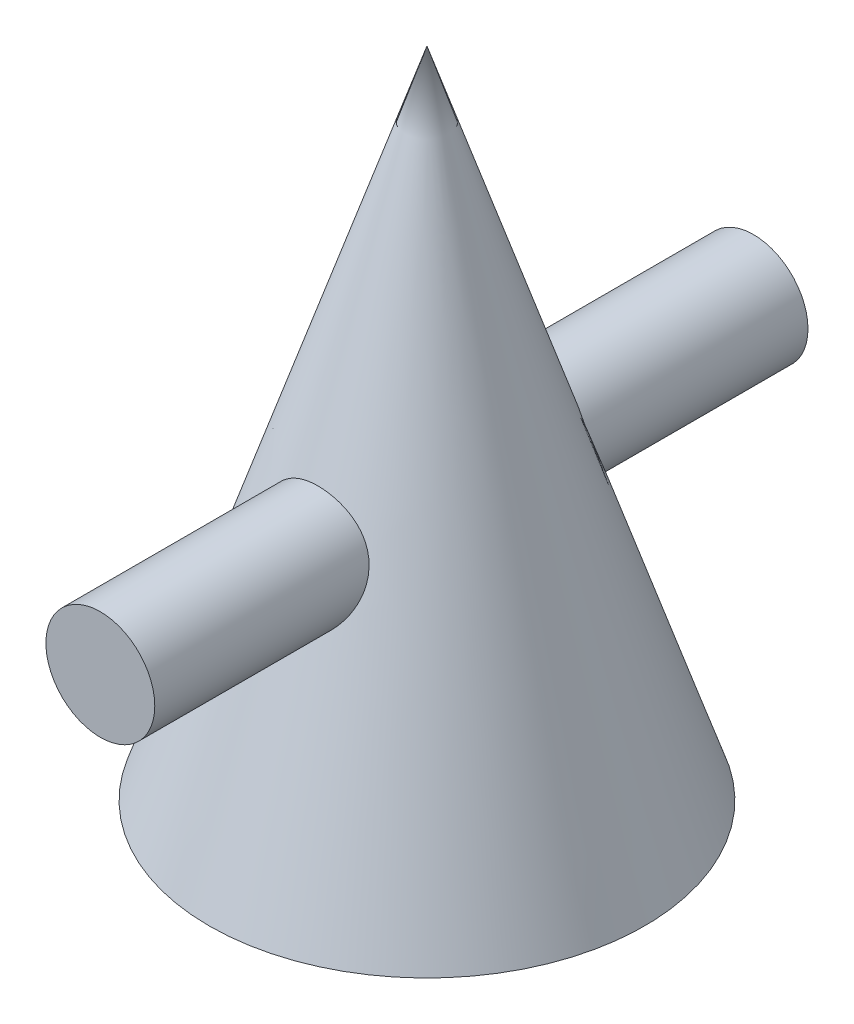
ISO-10303-21;
HEADER;
FILE_DESCRIPTION(('STEP AP214'),'2;1');
FILE_NAME('part.step','',(''),(''),'','','');
FILE_SCHEMA(('AUTOMOTIVE_DESIGN { 1 0 10303 214 1 1 1 1 }'));
ENDSEC;
DATA;
#1=APPLICATION_CONTEXT('core data for automotive mechanical design processes');
#2=APPLICATION_PROTOCOL_DEFINITION('international standard','automotive_design',2000,#1);
#3=PRODUCT_CONTEXT('',#1,'mechanical');
#4=PRODUCT('Part','Part','',(#3));
#5=PRODUCT_RELATED_PRODUCT_CATEGORY('part','',(#4));
#6=PRODUCT_DEFINITION_FORMATION('','',#4);
#7=PRODUCT_DEFINITION_CONTEXT('part definition',#1,'design');
#8=PRODUCT_DEFINITION('design','',#6,#7);
#9=PRODUCT_DEFINITION_SHAPE('','',#8);
#10=(LENGTH_UNIT() NAMED_UNIT(*) SI_UNIT(.MILLI.,.METRE.));
#11=(NAMED_UNIT(*) PLANE_ANGLE_UNIT() SI_UNIT($,.RADIAN.));
#12=(NAMED_UNIT(*) SI_UNIT($,.STERADIAN.) SOLID_ANGLE_UNIT());
#13=UNCERTAINTY_MEASURE_WITH_UNIT(LENGTH_MEASURE(1.E-05),#10,'distance_accuracy_value','');
#14=(GEOMETRIC_REPRESENTATION_CONTEXT(3) GLOBAL_UNCERTAINTY_ASSIGNED_CONTEXT((#13)) GLOBAL_UNIT_ASSIGNED_CONTEXT((#10,
#11,#12)) REPRESENTATION_CONTEXT('',''));
#15=CARTESIAN_POINT('',(0.,0.,0.));
#16=DIRECTION('',(0.,0.,1.));
#17=DIRECTION('',(1.,0.,0.));
#18=AXIS2_PLACEMENT_3D('',#15,#16,#17);
#19=CARTESIAN_POINT('',(0.,0.,0.));
#20=DIRECTION('',(0.,1.,0.));
#21=DIRECTION('',(0.,0.,1.));
#22=AXIS2_PLACEMENT_3D('',#19,#20,#21);
#23=PLANE('',#22);
#24=CARTESIAN_POINT('',(0.,0.,0.));
#25=DIRECTION('',(0.,1.,0.));
#26=DIRECTION('',(0.,0.,1.));
#27=AXIS2_PLACEMENT_3D('',#24,#25,#26);
#28=CIRCLE('',#27,20.);
#29=CARTESIAN_POINT('',(0.,0.,20.));
#30=VERTEX_POINT('',#29);
#31=EDGE_CURVE('E76',#30,#30,#28,.T.);
#32=ORIENTED_EDGE('',*,*,#31,.F.);
#33=EDGE_LOOP('',(#32));
#34=FACE_BOUND('',#33,.T.);
#35=ADVANCED_FACE('F42',(#34),#23,.F.);
#36=CARTESIAN_POINT('',(0.,60.,0.));
#37=DIRECTION('',(0.,-1.,0.));
#38=DIRECTION('',(0.,0.,-1.));
#39=AXIS2_PLACEMENT_3D('',#36,#37,#38);
#40=CONICAL_SURFACE('',#39,0.,0.321750554396642);
#41=CARTESIAN_POINT('',(-3.2209332369045,21.1756571595625,-12.5342183900275));
#42=CARTESIAN_POINT('',(-3.45925500497229,21.3763857942544,-12.4038884364813));
#43=CARTESIAN_POINT('',(-3.67614715504448,21.5971953916883,-12.2638412858528));
#44=CARTESIAN_POINT('',(-3.96673131480652,21.9522717403562,-12.0468249400583));
#45=CARTESIAN_POINT('',(-4.05795852596773,22.0748965122797,-11.9731629484742));
#46=CARTESIAN_POINT('',(-4.22855047512522,22.3274460681251,-11.8246187516191));
#47=CARTESIAN_POINT('',(-4.30791729823006,22.4573695633602,-11.7497367634021));
#48=CARTESIAN_POINT('',(-4.52739417497622,22.8564616705921,-11.5252847148287));
#49=CARTESIAN_POINT('',(-4.64947469715935,23.1356818490527,-11.3754539497436));
#50=CARTESIAN_POINT('',(-4.84172710109212,23.7151772323372,-11.0845119427179));
#51=CARTESIAN_POINT('',(-4.9119760224788,24.0154204593751,-10.9433880466567));
#52=CARTESIAN_POINT('',(-4.98954299859606,24.5837508838531,-10.6994685693297));
#53=CARTESIAN_POINT('',(-5.00493816468511,24.849593267777,-10.5941240012219));
#54=CARTESIAN_POINT('',(-4.99543916036162,25.2523248410625,-10.4499517010728));
#55=CARTESIAN_POINT('',(-4.98683558300799,25.3872590700205,-10.404193457849));
#56=CARTESIAN_POINT('',(-4.95842927158534,25.6575887624345,-10.3178784384733));
#57=CARTESIAN_POINT('',(-4.93863142830989,25.792983998815,-10.2773194002667));
#58=CARTESIAN_POINT('',(-4.88742584967866,26.0640564284338,-10.2016679998235));
#59=CARTESIAN_POINT('',(-4.85594613370615,26.1997300711346,-10.1666114896814));
#60=CARTESIAN_POINT('',(-4.78130450758494,26.4692397836161,-10.1026268922091));
#61=CARTESIAN_POINT('',(-4.73814785944398,26.6030766526323,-10.0736960548926));
#62=CARTESIAN_POINT('',(-4.6402261945146,26.8676725610154,-10.0220638934974));
#63=CARTESIAN_POINT('',(-4.58546122747281,26.9984316135693,-9.99936254272369));
#64=CARTESIAN_POINT('',(-4.46460194291903,27.2555496525593,-9.96005792576671));
#65=CARTESIAN_POINT('',(-4.3985084488912,27.3819089580156,-9.94345421661411));
#66=CARTESIAN_POINT('',(-4.2624684814096,27.6168581634779,-9.91730528108162));
#67=CARTESIAN_POINT('',(-4.19353293133286,27.7259765052706,-9.90722810942536));
#68=CARTESIAN_POINT('',(-4.04724490537266,27.9387900961235,-9.89128048284768));
#69=CARTESIAN_POINT('',(-3.96988973783807,28.0424835951474,-9.88541137777138));
#70=CARTESIAN_POINT('',(-3.80731127142618,28.2436236632803,-9.87733817465923));
#71=CARTESIAN_POINT('',(-3.72208966282289,28.3410715668004,-9.87513329121261));
#72=CARTESIAN_POINT('',(-3.54432963755793,28.5290922280842,-9.87375858867057));
#73=CARTESIAN_POINT('',(-3.45178855070068,28.6196624529864,-9.87458988223604));
#74=CARTESIAN_POINT('',(-3.16001228576675,28.8838127230544,-9.88072795687417));
#75=CARTESIAN_POINT('',(-2.95000331391139,29.0456448041604,-9.88979317421766));
#76=CARTESIAN_POINT('',(-2.50721121311983,29.334021634437,-9.91210009707711));
#77=CARTESIAN_POINT('',(-2.27442319991413,29.4605587931953,-9.92534269966527));
#78=CARTESIAN_POINT('',(-1.90561365072037,29.6247391077765,-9.94495457093931));
#79=CARTESIAN_POINT('',(-1.77559817452167,29.676194750393,-9.95162611774901));
#80=CARTESIAN_POINT('',(-1.51169594903751,29.7680467416729,-9.96414977537509));
#81=CARTESIAN_POINT('',(-1.37781051741817,29.8084468066887,-9.97000216122992));
#82=CARTESIAN_POINT('',(-1.10706366299679,29.8779044315475,-9.98039418618203));
#83=CARTESIAN_POINT('',(-0.970201785626572,29.9069602458502,-9.984933623228));
#84=CARTESIAN_POINT('',(-0.694479317916108,29.9535081417865,-9.99233900223082));
#85=CARTESIAN_POINT('',(-0.555618754026798,29.9710003763108,-9.99520496631384));
#86=CARTESIAN_POINT('',(-0.276744576835285,29.9942979789291,-9.99904404947883));
#87=CARTESIAN_POINT('',(-0.136729888518575,30.0000908188561,-10.0000151394182));
#88=CARTESIAN_POINT('',(0.143292288606563,29.9999070278888,-9.99998450170604));
#89=CARTESIAN_POINT('',(0.283299777379557,29.9939303437495,-9.99898276512944));
#90=CARTESIAN_POINT('',(0.562292931787183,29.9702541673028,-9.99508273819074));
#91=CARTESIAN_POINT('',(0.701278594226469,29.9525546383526,-9.99218444190046));
#92=CARTESIAN_POINT('',(0.97723046606362,29.9055692873507,-9.98471533911539));
#93=CARTESIAN_POINT('',(1.11419667987909,29.8762834906481,-9.98014453627982));
#94=CARTESIAN_POINT('',(1.38407692971106,29.8066205246694,-9.96973638392942));
#95=CARTESIAN_POINT('',(1.51701435684635,29.7663323593887,-9.96390927377048));
#96=CARTESIAN_POINT('',(1.77909192365652,29.6748372392566,-9.95144797774949));
#97=CARTESIAN_POINT('',(1.90823065417155,29.6236262892057,-9.94481349695988));
#98=CARTESIAN_POINT('',(2.16177754910499,29.5106516366006,-9.93133475118512));
#99=CARTESIAN_POINT('',(2.28618623807247,29.448889108386,-9.92449050961483));
#100=CARTESIAN_POINT('',(2.52949850178004,29.3151955836293,-9.9112795032193));
#101=CARTESIAN_POINT('',(2.6484001298698,29.2432610273238,-9.9049129067478));
#102=CARTESIAN_POINT('',(2.88142745766641,29.088666145443,-9.89334821150828));
#103=CARTESIAN_POINT('',(2.99546593103022,29.0058729463056,-9.88816722903751));
#104=CARTESIAN_POINT('',(3.21619454452515,28.8309168388366,-9.87993887779982));
#105=CARTESIAN_POINT('',(3.32288495511026,28.7387542756649,-9.87689143046778));
#106=CARTESIAN_POINT('',(3.52812036871961,28.5457310220939,-9.87380284440516));
#107=CARTESIAN_POINT('',(3.62666615257184,28.4448711674056,-9.87376141715173));
#108=CARTESIAN_POINT('',(3.81481986777864,28.2352699849123,-9.87753417126939));
#109=CARTESIAN_POINT('',(3.90443174135629,28.1265321702795,-9.88134664370181));
#110=CARTESIAN_POINT('',(4.07158097610214,27.9053197773062,-9.89342122343144));
#111=CARTESIAN_POINT('',(4.14939404484934,27.793046347284,-9.90155046562751));
#112=CARTESIAN_POINT('',(4.29536243099593,27.5628931658597,-9.92275938321303));
#113=CARTESIAN_POINT('',(4.36352187968418,27.4450158416799,-9.93583693211227));
#114=CARTESIAN_POINT('',(4.48973689344188,27.204694804929,-9.96736939926056));
#115=CARTESIAN_POINT('',(4.54779482156938,27.0822521684859,-9.98582305716277));
#116=CARTESIAN_POINT('',(4.65349543256387,26.8339012579279,-10.0283416405979));
#117=CARTESIAN_POINT('',(4.70113849492645,26.7079931102772,-10.0524063616094));
#118=CARTESIAN_POINT('',(4.78336390503327,26.4612774455458,-10.1046005389697));
#119=CARTESIAN_POINT('',(4.81854695903761,26.3406020463029,-10.1324101275608));
#120=CARTESIAN_POINT('',(4.87953484411592,26.0980880434929,-10.1928764790085));
#121=CARTESIAN_POINT('',(4.90533657007667,25.9762490684646,-10.2255348417264));
#122=CARTESIAN_POINT('',(4.96877000211211,25.6103246497227,-10.3303962696578));
#123=CARTESIAN_POINT('',(4.99248342686718,25.365668558972,-10.4095202892146));
#124=CARTESIAN_POINT('',(5.00475428579401,24.8696642555297,-10.5867911740507));
#125=CARTESIAN_POINT('',(4.99160313915852,24.6185436472077,-10.6856585253142));
#126=CARTESIAN_POINT('',(4.92925831348805,24.1258656296517,-10.8950627613506));
#127=CARTESIAN_POINT('',(4.88004933609906,23.8843123254293,-11.0056045822395));
#128=CARTESIAN_POINT('',(4.73793445970382,23.3778414914432,-11.2510949703599));
#129=CARTESIAN_POINT('',(4.63947851982227,23.1150327141387,-11.3871846793026));
#130=CARTESIAN_POINT('',(4.40074523824905,22.610115875867,-11.6616107619241));
#131=CARTESIAN_POINT('',(4.26042108244267,22.3680313793428,-11.7999494857138));
#132=CARTESIAN_POINT('',(3.9215780756212,21.8825420522126,-12.0874580015736));
#133=CARTESIAN_POINT('',(3.71825157890789,21.6421268835653,-12.2360669720988));
#134=CARTESIAN_POINT('',(3.26448824997511,21.1995670998829,-12.5173307556105));
#135=CARTESIAN_POINT('',(3.01411657033138,20.9973703241171,-12.6500072218116));
#136=CARTESIAN_POINT('',(2.53723301055235,20.6846353535836,-12.859027903891));
#137=CARTESIAN_POINT('',(2.3200791622113,20.563791383888,-12.9411938913036));
#138=CARTESIAN_POINT('',(1.97868647542914,20.4064672976468,-13.0492102988933));
#139=CARTESIAN_POINT('',(1.86225811728499,20.3580102359096,-13.082681265453));
#140=CARTESIAN_POINT('',(1.62477749694263,20.2696590698489,-13.1439636329688));
#141=CARTESIAN_POINT('',(1.50372720564239,20.2297613626144,-13.171777414961));
#142=CARTESIAN_POINT('',(1.25689198254257,20.1588400641618,-13.2213732647337));
#143=CARTESIAN_POINT('',(1.13107987996507,20.1278804219504,-13.2431118325894));
#144=CARTESIAN_POINT('',(0.876531673880262,20.0757173886499,-13.2798159115595));
#145=CARTESIAN_POINT('',(0.747796983933274,20.0545093822367,-13.2947846267029));
#146=CARTESIAN_POINT('',(0.488465098579907,20.0222020461892,-13.3176121526943));
#147=CARTESIAN_POINT('',(0.357868303548887,20.011100575847,-13.3254724691998));
#148=CARTESIAN_POINT('',(0.0959771756294887,19.9992035187784,-13.3338966772348));
#149=CARTESIAN_POINT('',(-0.0353170878445333,19.998406925012,-13.3344612817348));
#150=CARTESIAN_POINT('',(-0.283346319053828,20.0066619020321,-13.328615245859));
#151=CARTESIAN_POINT('',(-0.400135537346753,20.0146685492152,-13.3229446980666));
#152=CARTESIAN_POINT('',(-0.632489391918406,20.0387900540529,-13.3058881572167));
#153=CARTESIAN_POINT('',(-0.748053622738633,20.0549075156981,-13.2945003286193));
#154=CARTESIAN_POINT('',(-0.977109663204492,20.0950259038819,-13.2662213769186));
#155=CARTESIAN_POINT('',(-1.09060166208658,20.1190261067284,-13.2493307590119));
#156=CARTESIAN_POINT('',(-1.31482354418683,20.1745878721034,-13.210352070443));
#157=CARTESIAN_POINT('',(-1.42555238775429,20.2061522346969,-13.1882620751539));
#158=CARTESIAN_POINT('',(-1.75403126142688,20.3120966870179,-13.1144072612218));
#159=CARTESIAN_POINT('',(-1.96668960722503,20.3974807677605,-13.0552341954856));
#160=CARTESIAN_POINT('',(-2.37400203754703,20.5937237563578,-12.9208559337095));
#161=CARTESIAN_POINT('',(-2.56867086796113,20.7045615355082,-12.845664038365));
#162=CARTESIAN_POINT('',(-2.83522966607086,20.8803965817318,-12.7282106639123));
#163=CARTESIAN_POINT('',(-2.91524536964878,20.9366501447546,-12.6908628427688));
#164=CARTESIAN_POINT('',(-3.07117024766713,21.0531795666113,-12.6140600884603));
#165=CARTESIAN_POINT('',(-3.14708067768422,21.1134541828853,-12.5746058069659));
#166=CARTESIAN_POINT('',(-3.2209332369045,21.1756571595625,-12.5342183900275));
#167=B_SPLINE_CURVE_WITH_KNOTS('',3,(#41,#42,#43,#44,#45,#46,#47,#48,#49,#50,#51,#52,#53,#54,
#55,#56,#57,#58,#59,#60,#61,#62,#63,#64,#65,#66,#67,#68,#69,#70,#71,#72,#73,#74,#75,#76,#77,#78,
#79,#80,#81,#82,#83,#84,#85,#86,#87,#88,#89,#90,#91,#92,#93,#94,#95,#96,#97,#98,#99,#100,#101,
#102,#103,#104,#105,#106,#107,#108,#109,#110,#111,#112,#113,#114,#115,#116,#117,#118,#119,#120,
#121,#122,#123,#124,#125,#126,#127,#128,#129,#130,#131,#132,#133,#134,#135,#136,#137,#138,#139,
#140,#141,#142,#143,#144,#145,#146,#147,#148,#149,#150,#151,#152,#153,#154,#155,#156,#157,#158,
#159,#160,#161,#162,#163,#164,#165,#166),.UNSPECIFIED.,.T.,.F.,(4,2,2,2,2,2,2,2,2,2,2,2,2,2,2,2,
2,2,2,2,2,2,2,2,2,2,2,2,2,2,2,2,2,2,2,2,2,2,2,2,2,2,2,2,2,2,2,2,2,2,2,2,2,2,2,2,2,2,2,2,2,2,4),
(0.,1.01277231171621,1.52134613914095,2.02983045159058,3.04370113327686,4.05606180080266,
4.91124674513196,5.33902070242725,5.76660790881421,6.19687476617832,6.6269480532149,
7.05701949723978,7.4870596921054,7.87499256222771,8.26304981614794,8.65102388086622,
9.0391401398223,9.8313293767766,10.6236888482757,11.0432279839255,11.4626259170182,
11.8820883574746,12.3015452517938,12.7214510792307,13.1413588063185,13.5612678459399,
13.9811759668621,14.3977830086429,14.8145426938528,15.2312560259021,15.6481155519009,
16.0706590185928,16.4931869247616,16.915674275941,17.3379743652677,17.7479717558089,
18.1577931534062,18.5675185518286,18.9772290182382,19.3629877855988,19.748874118755,
20.5201276135758,21.327709779064,22.1356347781724,23.0676338537096,24.0006789558628,
25.0399881008002,26.0778683820685,26.8596369555949,27.2506501292925,27.6414983884666,
28.0350774143059,28.4284699720291,28.8217791842221,29.215049960138,29.5662289702668,
29.9175207990031,30.2687803856441,30.6201702013092,31.3271510379845,32.0335471290414,
32.3474875702606,32.6613314450107),.UNSPECIFIED.);
#168=CARTESIAN_POINT('',(-3.2209332369045,21.1756571595625,-12.5342183900275));
#169=VERTEX_POINT('',#168);
#170=EDGE_CURVE('E12',#169,#169,#167,.T.);
#171=ORIENTED_EDGE('',*,*,#170,.F.);
#172=EDGE_LOOP('',(#171));
#173=FACE_BOUND('',#172,.T.);
#174=CARTESIAN_POINT('',(-3.50810880098562,28.5627479058252,9.87443035204662));
#175=CARTESIAN_POINT('',(-3.60099194204786,28.4712908669646,9.87378449819559));
#176=CARTESIAN_POINT('',(-3.69028891765064,28.3762045612337,9.87452615477475));
#177=CARTESIAN_POINT('',(-3.8611688193612,28.1793645249757,9.879447252575));
#178=CARTESIAN_POINT('',(-3.94275010428243,28.0776093836938,9.88362742336894));
#179=CARTESIAN_POINT('',(-4.0976370547432,27.8681600648866,9.89603109677955));
#180=CARTESIAN_POINT('',(-4.17093988185382,27.7604638690813,9.90425598105994));
#181=CARTESIAN_POINT('',(-4.30877002086011,27.5399625257259,9.92525486751931));
#182=CARTESIAN_POINT('',(-4.37329439757399,27.4271556860934,9.93803038611746));
#183=CARTESIAN_POINT('',(-4.49316229326092,27.1973384216834,9.96850199352568));
#184=CARTESIAN_POINT('',(-4.54850172573463,27.0803261538725,9.98620026321042));
#185=CARTESIAN_POINT('',(-4.64969783907166,26.8430811368289,10.0267239693588));
#186=CARTESIAN_POINT('',(-4.69555103268757,26.7228472215637,10.049551284907));
#187=CARTESIAN_POINT('',(-4.77757638009999,26.4802539357774,10.1003436918869));
#188=CARTESIAN_POINT('',(-4.81375319760857,26.3578956195438,10.1283062972683));
#189=CARTESIAN_POINT('',(-4.87644990316555,26.1119148732999,10.1892454190802));
#190=CARTESIAN_POINT('',(-4.90296606995708,25.9882919749867,10.2222238606788));
#191=CARTESIAN_POINT('',(-4.94621595401357,25.7419146518488,10.2925599902214));
#192=CARTESIAN_POINT('',(-4.96304175235584,25.6191633828634,10.3298722664033));
#193=CARTESIAN_POINT('',(-4.98750812555225,25.3740924443067,10.4087384108587));
#194=CARTESIAN_POINT('',(-4.9951454621182,25.251772942037,10.4502937689265));
#195=CARTESIAN_POINT('',(-5.00463661445453,24.8865159151777,10.5806387938314));
#196=CARTESIAN_POINT('',(-4.99309028038074,24.6451579896837,10.6751426627159));
#197=CARTESIAN_POINT('',(-4.93346301870424,24.1447722956015,10.8862586191149));
#198=CARTESIAN_POINT('',(-4.88144930815029,23.8867778617308,11.0041609595658));
#199=CARTESIAN_POINT('',(-4.73929957180387,23.3853674723583,11.2477092817592));
#200=CARTESIAN_POINT('',(-4.64914033376179,23.1419604967243,11.3733599386571));
#201=CARTESIAN_POINT('',(-4.41601787629939,22.6361317096081,11.6466852933054));
#202=CARTESIAN_POINT('',(-4.2670191773454,22.3766491243897,11.7947433370582));
#203=CARTESIAN_POINT('',(-4.00952599236754,22.0089886093939,12.0126294366113));
#204=CARTESIAN_POINT('',(-3.91793180414195,21.8899321009095,12.0846205375976));
#205=CARTESIAN_POINT('',(-3.72355019955806,21.6596607194163,12.2261784643358));
#206=CARTESIAN_POINT('',(-3.62076104529373,21.5484470683598,12.2957449114656));
#207=CARTESIAN_POINT('',(-3.40038999163373,21.3309161436664,12.4337330840007));
#208=CARTESIAN_POINT('',(-3.28240876485913,21.2249192782658,12.5020234385628));
#209=CARTESIAN_POINT('',(-3.03520277065423,21.0234496355037,12.6334013131002));
#210=CARTESIAN_POINT('',(-2.90598435315308,20.927970982758,12.6964917327036));
#211=CARTESIAN_POINT('',(-2.63702526719801,20.7488658876667,12.8160177977796));
#212=CARTESIAN_POINT('',(-2.49730320992308,20.6652192047539,12.8724647794787));
#213=CARTESIAN_POINT('',(-2.2080927729134,20.5109920041757,12.9773641841104));
#214=CARTESIAN_POINT('',(-2.05860923754121,20.4404050709811,13.0258205311192));
#215=CARTESIAN_POINT('',(-1.68943391934398,20.2883209964427,13.1308436070066));
#216=CARTESIAN_POINT('',(-1.46552979939039,20.213710806692,13.1829303204262));
#217=CARTESIAN_POINT('',(-1.0057611214155,20.0964635372839,13.2651378816027));
#218=CARTESIAN_POINT('',(-0.769906475337432,20.0538004091399,13.295276624394));
#219=CARTESIAN_POINT('',(-0.291899712506512,20.0027309872539,13.3313835375807));
#220=CARTESIAN_POINT('',(-0.0497308841128645,19.9944274376671,13.3372792145193));
#221=CARTESIAN_POINT('',(0.432589272243802,20.0129042771736,13.3241947684794));
#222=CARTESIAN_POINT('',(0.672740407815774,20.0396879745396,13.3052122998139));
#223=CARTESIAN_POINT('',(1.1331400636925,20.1247182442844,13.2453100537844));
#224=CARTESIAN_POINT('',(1.35379824589949,20.1815018950982,13.2054109073133));
#225=CARTESIAN_POINT('',(1.78161594949703,20.3227528553173,13.1070198547238));
#226=CARTESIAN_POINT('',(1.98877234715784,20.4072265439375,13.0485236643228));
#227=CARTESIAN_POINT('',(2.40208546428728,20.608304203561,12.9109152780825));
#228=CARTESIAN_POINT('',(2.60681406082771,20.7269500648451,12.8305208638516));
#229=CARTESIAN_POINT('',(2.99371885494549,20.98848409672,12.6562502771285));
#230=CARTESIAN_POINT('',(3.17588432571526,21.1313837219323,12.5623677376656));
#231=CARTESIAN_POINT('',(3.54455571676058,21.4634057417787,12.3488006347043));
#232=CARTESIAN_POINT('',(3.7267175610257,21.6562623115201,12.2274242977166));
#233=CARTESIAN_POINT('',(4.05689043831171,22.0655654464381,11.9779437495761));
#234=CARTESIAN_POINT('',(4.20486813081198,22.282034741274,11.8498331185283));
#235=CARTESIAN_POINT('',(4.4855095093071,22.7703402085158,11.5724937827582));
#236=CARTESIAN_POINT('',(4.61218306749985,23.0455456254447,11.4230883458782));
#237=CARTESIAN_POINT('',(4.81471367199718,23.6177467362003,11.1317220492422));
#238=CARTESIAN_POINT('',(4.89058704479773,23.9147353951062,10.9897588111961));
#239=CARTESIAN_POINT('',(4.98002735761432,24.4812077465684,10.7416347769303));
#240=CARTESIAN_POINT('',(5.00097883485872,24.7485142282557,10.6332604035705));
#241=CARTESIAN_POINT('',(4.99945694762331,25.1541072503244,10.4843183872032));
#242=CARTESIAN_POINT('',(4.99345533247797,25.2900943778048,10.4369359162295));
#243=CARTESIAN_POINT('',(4.97010934463948,25.5627707611038,10.3473334283998));
#244=CARTESIAN_POINT('',(4.95276995915305,25.6994596820039,10.305111151389));
#245=CARTESIAN_POINT('',(4.90631348520248,25.9734044707789,10.2261218461884));
#246=CARTESIAN_POINT('',(4.87712080884679,26.1106582732163,10.1893919391042));
#247=CARTESIAN_POINT('',(4.80681033644526,26.3836307183504,10.1221108691041));
#248=CARTESIAN_POINT('',(4.76569250236434,26.5193493561494,10.0915597258959));
#249=CARTESIAN_POINT('',(4.67158527175537,26.7878833565246,10.036820742093));
#250=CARTESIAN_POINT('',(4.61859924788064,26.9206995321649,10.0126310979511));
#251=CARTESIAN_POINT('',(4.50099602687517,27.1821021965973,9.97052174613786));
#252=CARTESIAN_POINT('',(4.43637979147615,27.3106890340849,9.95260152039268));
#253=CARTESIAN_POINT('',(4.30330586393797,27.5491586838179,9.924243866781));
#254=CARTESIAN_POINT('',(4.23595495926059,27.6595919935434,9.91322023810977));
#255=CARTESIAN_POINT('',(4.09269151187455,27.8751752067192,9.89550138646579));
#256=CARTESIAN_POINT('',(4.01677608855644,27.9803233152408,9.88880762493818));
#257=CARTESIAN_POINT('',(3.85692630898209,28.1844808631936,9.87922358463679));
#258=CARTESIAN_POINT('',(3.77299389360252,28.2834917788879,9.87633238777043));
#259=CARTESIAN_POINT('',(3.59765467585462,28.4747283776816,9.87372970736995));
#260=CARTESIAN_POINT('',(3.5062449527484,28.5669513823505,9.8740194723064));
#261=CARTESIAN_POINT('',(3.21882089332177,28.8351577716748,9.87871345630106));
#262=CARTESIAN_POINT('',(3.01195859568675,28.9996787742635,9.88704471044947));
#263=CARTESIAN_POINT('',(2.57507263186608,29.293998460855,9.90839810737684));
#264=CARTESIAN_POINT('',(2.34504389256462,29.423789516646,9.92142127923422));
#265=CARTESIAN_POINT('',(1.97987958427023,29.5934290405901,9.94106128424115));
#266=CARTESIAN_POINT('',(1.85091649524494,29.6468905272866,9.94781425332882));
#267=CARTESIAN_POINT('',(1.58895792843268,29.7428519593094,9.960611354461));
#268=CARTESIAN_POINT('',(1.45596383769813,29.7853556283816,9.96665572692295));
#269=CARTESIAN_POINT('',(1.18680564748329,29.8591127060805,9.97752228115703));
#270=CARTESIAN_POINT('',(1.05064059402056,29.8903626812435,9.98234408979654));
#271=CARTESIAN_POINT('',(0.776177034607414,29.9413582950978,9.99037740976247));
#272=CARTESIAN_POINT('',(0.637879367571946,29.9611083447474,9.99358953843835));
#273=CARTESIAN_POINT('',(0.359597605132404,29.9890192891935,9.99816579139096));
#274=CARTESIAN_POINT('',(0.219609293330182,29.9971392483789,9.99952338730895));
#275=CARTESIAN_POINT('',(-0.0605615961404601,30.0015958631247,10.0002658412738));
#276=CARTESIAN_POINT('',(-0.200744175787877,29.9979323977529,9.9996506790745));
#277=CARTESIAN_POINT('',(-0.480326335186476,29.9788477923209,9.99649395766776));
#278=CARTESIAN_POINT('',(-0.619725667971389,29.9634231327471,9.99395182181871));
#279=CARTESIAN_POINT('',(-0.896691763716896,29.9209320901732,9.98713659954072));
#280=CARTESIAN_POINT('',(-1.03425856397364,29.8938659444778,9.98286354839557));
#281=CARTESIAN_POINT('',(-1.30543227574378,29.8285744986638,9.97296773152846));
#282=CARTESIAN_POINT('',(-1.4390628509659,29.7904456057168,9.96735669800088));
#283=CARTESIAN_POINT('',(-1.70270674201854,29.7031987856014,9.95522296403279));
#284=CARTESIAN_POINT('',(-1.83271848171493,29.6540761519285,9.9486998735839));
#285=CARTESIAN_POINT('',(-2.0880045630121,29.5452678926964,9.93532817404744));
#286=CARTESIAN_POINT('',(-2.2132855090336,29.4855977077321,9.9284800513516));
#287=CARTESIAN_POINT('',(-2.45847656981758,29.3560446215895,9.91512083351453));
#288=CARTESIAN_POINT('',(-2.5783861417316,29.2861606912057,9.90860977242752));
#289=CARTESIAN_POINT('',(-2.84137756196502,29.117848454689,9.89517465656971));
#290=CARTESIAN_POINT('',(-2.98271932722749,29.016658603633,9.88855729040024));
#291=CARTESIAN_POINT('',(-3.25420004518164,28.8000438175528,9.87861535325462));
#292=CARTESIAN_POINT('',(-3.38433833184812,28.6846180372209,9.87529097791717));
#293=CARTESIAN_POINT('',(-3.50810880098562,28.5627479058252,9.87443035204662));
#294=B_SPLINE_CURVE_WITH_KNOTS('',3,(#174,#175,#176,#177,#178,#179,#180,#181,#182,#183,#184,
#185,#186,#187,#188,#189,#190,#191,#192,#193,#194,#195,#196,#197,#198,#199,#200,#201,#202,#203,
#204,#205,#206,#207,#208,#209,#210,#211,#212,#213,#214,#215,#216,#217,#218,#219,#220,#221,#222,
#223,#224,#225,#226,#227,#228,#229,#230,#231,#232,#233,#234,#235,#236,#237,#238,#239,#240,#241,
#242,#243,#244,#245,#246,#247,#248,#249,#250,#251,#252,#253,#254,#255,#256,#257,#258,#259,#260,
#261,#262,#263,#264,#265,#266,#267,#268,#269,#270,#271,#272,#273,#274,#275,#276,#277,#278,#279,
#280,#281,#282,#283,#284,#285,#286,#287,#288,#289,#290,#291,#292,#293),.UNSPECIFIED.,.T.,.F.,(4,
2,2,2,2,2,2,2,2,2,2,2,2,2,2,2,2,2,2,2,2,2,2,2,2,2,2,2,2,2,2,2,2,2,2,2,2,2,2,2,2,2,2,2,2,2,2,2,2,
2,2,2,2,2,2,2,2,2,2,4),(0.,0.390922432887706,0.781927831835812,1.17306689010012,
1.56433641072917,1.95577954822751,2.34736632990064,2.73876403745576,3.13031235135921,
3.51807590152338,3.90597607114257,4.68139483367839,5.54333495823355,6.40580034518124,
7.40253708679609,7.9018001825694,8.40114089469557,8.91845809525392,9.43548484568234,
9.95161615254132,10.4674932356372,11.189234966383,11.9103875721396,12.6336950619447,
13.3570707551844,14.0480471467552,14.7391828370791,15.4860599492618,16.2332907847903,
17.1051572281264,17.9778704643439,18.986726364457,19.9952578760249,20.8589165826944,
21.2908536136067,21.7226007737282,22.1571455233026,22.5916916588651,23.0261144632141,
23.4605013605288,23.849501594153,24.2386330572686,24.6276705510867,25.0168607406143,
25.8065361304815,26.5963848254167,27.0152722148927,27.434017067557,27.8528895698288,
28.2716013016391,28.6917832241305,29.1119694589265,29.5322814829813,29.952584939632,
30.3693303295615,30.7862544738211,31.2025732611539,31.6189340285217,32.1398227295433,
32.6607423750414),.UNSPECIFIED.);
#295=CARTESIAN_POINT('',(-3.50810880098562,28.5627479058252,9.87443035204662));
#296=VERTEX_POINT('',#295);
#297=EDGE_CURVE('E55',#296,#296,#294,.T.);
#298=ORIENTED_EDGE('',*,*,#297,.F.);
#299=EDGE_LOOP('',(#298));
#300=FACE_BOUND('',#299,.T.);
#301=ORIENTED_EDGE('',*,*,#31,.T.);
#302=EDGE_LOOP('',(#301));
#303=FACE_BOUND('',#302,.T.);
#304=CARTESIAN_POINT('',(0.,60.,0.));
#305=VERTEX_POINT('',#304);
#306=VERTEX_LOOP('',#305);
#307=FACE_BOUND('',#306,.T.);
#308=ADVANCED_FACE('F44',(#173,#300,#303,#307),#40,.T.);
#309=CARTESIAN_POINT('',(0.,25.,30.));
#310=DIRECTION('',(0.,0.,1.));
#311=DIRECTION('',(1.,0.,0.));
#312=AXIS2_PLACEMENT_3D('',#309,#310,#311);
#313=PLANE('',#312);
#314=CARTESIAN_POINT('',(0.,25.,30.));
#315=DIRECTION('',(0.,0.,1.));
#316=DIRECTION('',(1.,0.,0.));
#317=AXIS2_PLACEMENT_3D('',#314,#315,#316);
#318=CIRCLE('',#317,5.);
#319=CARTESIAN_POINT('',(5.,25.,30.));
#320=VERTEX_POINT('',#319);
#321=EDGE_CURVE('E117',#320,#320,#318,.T.);
#322=ORIENTED_EDGE('',*,*,#321,.T.);
#323=EDGE_LOOP('',(#322));
#324=FACE_BOUND('',#323,.T.);
#325=ADVANCED_FACE('F59',(#324),#313,.T.);
#326=CARTESIAN_POINT('',(0.,25.,-30.));
#327=DIRECTION('',(0.,0.,1.));
#328=DIRECTION('',(1.,0.,0.));
#329=AXIS2_PLACEMENT_3D('',#326,#327,#328);
#330=CYLINDRICAL_SURFACE('',#329,5.);
#331=ORIENTED_EDGE('',*,*,#297,.T.);
#332=EDGE_LOOP('',(#331));
#333=FACE_BOUND('',#332,.T.);
#334=ORIENTED_EDGE('',*,*,#321,.F.);
#335=EDGE_LOOP('',(#334));
#336=FACE_BOUND('',#335,.T.);
#337=ADVANCED_FACE('F65',(#333,#336),#330,.T.);
#338=ORIENTED_EDGE('',*,*,#170,.T.);
#339=EDGE_LOOP('',(#338));
#340=FACE_BOUND('',#339,.T.);
#341=CARTESIAN_POINT('',(0.,25.,-30.));
#342=DIRECTION('',(0.,0.,1.));
#343=DIRECTION('',(1.,0.,0.));
#344=AXIS2_PLACEMENT_3D('',#341,#342,#343);
#345=CIRCLE('',#344,5.);
#346=CARTESIAN_POINT('',(5.,25.,-30.));
#347=VERTEX_POINT('',#346);
#348=EDGE_CURVE('E80',#347,#347,#345,.T.);
#349=ORIENTED_EDGE('',*,*,#348,.T.);
#350=EDGE_LOOP('',(#349));
#351=FACE_BOUND('',#350,.T.);
#352=ADVANCED_FACE('F105',(#340,#351),#330,.T.);
#353=CARTESIAN_POINT('',(0.,25.,-30.));
#354=DIRECTION('',(0.,0.,1.));
#355=DIRECTION('',(1.,0.,0.));
#356=AXIS2_PLACEMENT_3D('',#353,#354,#355);
#357=PLANE('',#356);
#358=ORIENTED_EDGE('',*,*,#348,.F.);
#359=EDGE_LOOP('',(#358));
#360=FACE_BOUND('',#359,.T.);
#361=ADVANCED_FACE('F107',(#360),#357,.F.);
#362=CLOSED_SHELL('',(#35,#308,#325,#337,#352,#361));
#363=MANIFOLD_SOLID_BREP('B2',#362);
#364=ADVANCED_BREP_SHAPE_REPRESENTATION('',(#18,#363),#14);
#365=SHAPE_DEFINITION_REPRESENTATION(#9,#364);
ENDSEC;
END-ISO-10303-21;
